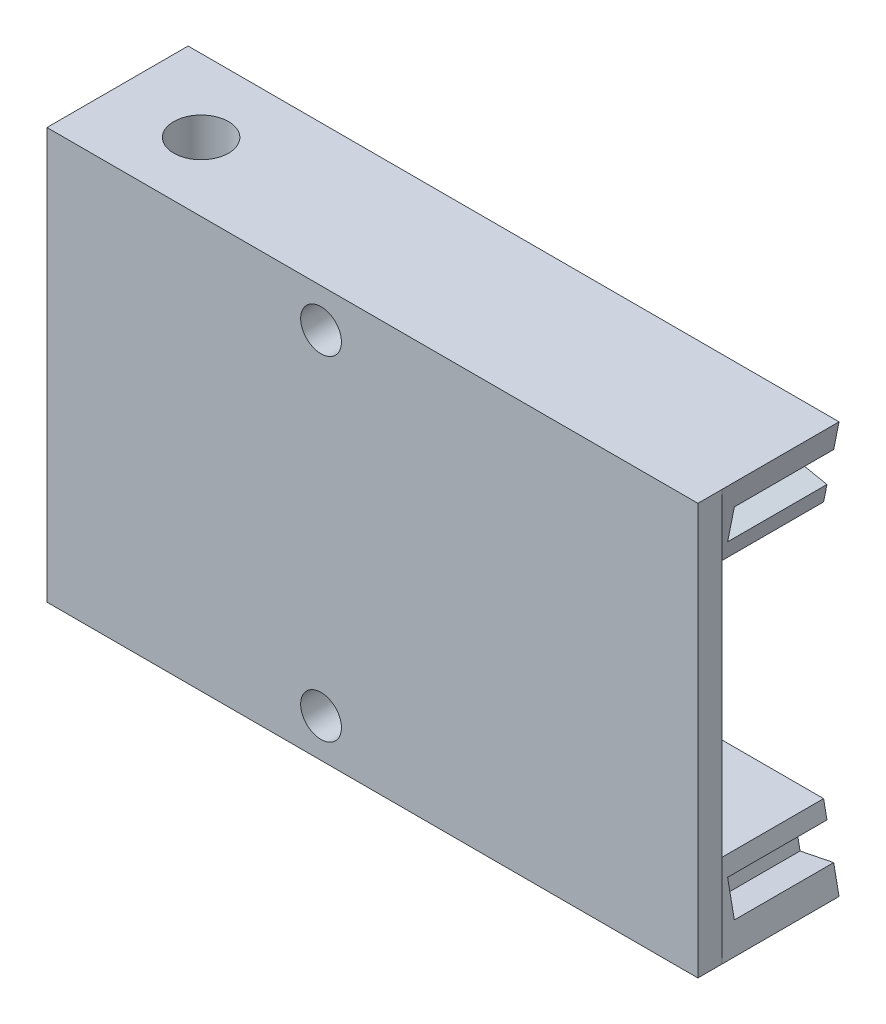
ISO-10303-21;
HEADER;
FILE_DESCRIPTION(('STEP AP214'),'2;1');
FILE_NAME('part.step','',(''),(''),'','','');
FILE_SCHEMA(('AUTOMOTIVE_DESIGN { 1 0 10303 214 1 1 1 1 }'));
ENDSEC;
DATA;
#1=APPLICATION_CONTEXT('core data for automotive mechanical design processes');
#2=APPLICATION_PROTOCOL_DEFINITION('international standard','automotive_design',2000,#1);
#3=PRODUCT_CONTEXT('',#1,'mechanical');
#4=PRODUCT('Part','Part','',(#3));
#5=PRODUCT_RELATED_PRODUCT_CATEGORY('part','',(#4));
#6=PRODUCT_DEFINITION_FORMATION('','',#4);
#7=PRODUCT_DEFINITION_CONTEXT('part definition',#1,'design');
#8=PRODUCT_DEFINITION('design','',#6,#7);
#9=PRODUCT_DEFINITION_SHAPE('','',#8);
#10=(LENGTH_UNIT() NAMED_UNIT(*) SI_UNIT(.MILLI.,.METRE.));
#11=(NAMED_UNIT(*) PLANE_ANGLE_UNIT() SI_UNIT($,.RADIAN.));
#12=(NAMED_UNIT(*) SI_UNIT($,.STERADIAN.) SOLID_ANGLE_UNIT());
#13=UNCERTAINTY_MEASURE_WITH_UNIT(LENGTH_MEASURE(1.E-05),#10,'distance_accuracy_value','');
#14=(GEOMETRIC_REPRESENTATION_CONTEXT(3) GLOBAL_UNCERTAINTY_ASSIGNED_CONTEXT((#13)) GLOBAL_UNIT_ASSIGNED_CONTEXT((#10,
#11,#12)) REPRESENTATION_CONTEXT('',''));
#15=CARTESIAN_POINT('',(0.,0.,0.));
#16=DIRECTION('',(0.,0.,1.));
#17=DIRECTION('',(1.,0.,0.));
#18=AXIS2_PLACEMENT_3D('',#15,#16,#17);
#19=CARTESIAN_POINT('',(0.,12.,-4.12));
#20=DIRECTION('',(0.,0.,1.));
#21=DIRECTION('',(1.,0.,0.));
#22=AXIS2_PLACEMENT_3D('',#19,#20,#21);
#23=PLANE('',#22);
#24=CARTESIAN_POINT('',(4.,1.125,-4.12));
#25=DIRECTION('',(0.,0.,-1.));
#26=DIRECTION('',(-1.,0.,0.));
#27=AXIS2_PLACEMENT_3D('',#24,#25,#26);
#28=CIRCLE('',#27,0.59563);
#29=CARTESIAN_POINT('',(3.40437,1.125,-4.12));
#30=VERTEX_POINT('',#29);
#31=EDGE_CURVE('E413',#30,#30,#28,.T.);
#32=ORIENTED_EDGE('',*,*,#31,.F.);
#33=EDGE_LOOP('',(#32));
#34=FACE_BOUND('',#33,.T.);
#35=DIRECTION('',(0.980580675704681,0.196116135069379,0.));
#36=VECTOR('',#35,1.);
#37=CARTESIAN_POINT('',(13.8635935270636,0.583012851373601,-4.12));
#38=LINE('',#37,#36);
#39=CARTESIAN_POINT('',(13.8635935270636,0.583012851373601,-4.12));
#40=VERTEX_POINT('',#39);
#41=CARTESIAN_POINT('',(14.8441742027683,0.77912898644298,-4.12));
#42=VERTEX_POINT('',#41);
#43=EDGE_CURVE('E188',#40,#42,#38,.T.);
#44=ORIENTED_EDGE('',*,*,#43,.T.);
#45=DIRECTION('',(0.196116135069379,-0.980580675704681,0.));
#46=VECTOR('',#45,1.);
#47=CARTESIAN_POINT('',(15.,0.,-4.12));
#48=LINE('',#47,#46);
#49=CARTESIAN_POINT('',(15.,0.,-4.12));
#50=VERTEX_POINT('',#49);
#51=EDGE_CURVE('E239',#42,#50,#48,.T.);
#52=ORIENTED_EDGE('',*,*,#51,.T.);
#53=DIRECTION('',(-1.,0.,0.));
#54=VECTOR('',#53,1.);
#55=CARTESIAN_POINT('',(0.,0.,-4.12));
#56=LINE('',#55,#54);
#57=CARTESIAN_POINT('',(-4.,0.,-4.12));
#58=VERTEX_POINT('',#57);
#59=EDGE_CURVE('E275',#50,#58,#56,.T.);
#60=ORIENTED_EDGE('',*,*,#59,.T.);
#61=DIRECTION('',(0.,-1.,0.));
#62=VECTOR('',#61,1.);
#63=CARTESIAN_POINT('',(-4.,2.25,-4.12));
#64=LINE('',#63,#62);
#65=CARTESIAN_POINT('',(-4.,2.25,-4.12));
#66=VERTEX_POINT('',#65);
#67=EDGE_CURVE('E210',#66,#58,#64,.T.);
#68=ORIENTED_EDGE('',*,*,#67,.F.);
#69=DIRECTION('',(1.,0.,0.));
#70=VECTOR('',#69,1.);
#71=CARTESIAN_POINT('',(0.,2.25,-4.12));
#72=LINE('',#71,#70);
#73=CARTESIAN_POINT('',(14.5500000001642,2.25,-4.12));
#74=VERTEX_POINT('',#73);
#75=EDGE_CURVE('E288',#66,#74,#72,.T.);
#76=ORIENTED_EDGE('',*,*,#75,.T.);
#77=CARTESIAN_POINT('',(14.6480580676989,1.75970966214765,-4.12));
#78=VERTEX_POINT('',#77);
#79=EDGE_CURVE('E177',#74,#78,#48,.T.);
#80=ORIENTED_EDGE('',*,*,#79,.T.);
#81=DIRECTION('',(0.980580675704681,0.196116135069379,0.));
#82=VECTOR('',#81,1.);
#83=CARTESIAN_POINT('',(13.6674773919942,1.56359352707828,-4.12));
#84=LINE('',#83,#82);
#85=CARTESIAN_POINT('',(13.6674773919942,1.56359352707828,-4.12));
#86=VERTEX_POINT('',#85);
#87=EDGE_CURVE('E54',#86,#78,#84,.T.);
#88=ORIENTED_EDGE('',*,*,#87,.F.);
#89=DIRECTION('',(0.196116135069379,-0.980580675704681,0.));
#90=VECTOR('',#89,1.);
#91=CARTESIAN_POINT('',(13.6674773919942,1.56359352707828,-4.12));
#92=LINE('',#91,#90);
#93=EDGE_CURVE('E165',#86,#40,#92,.T.);
#94=ORIENTED_EDGE('',*,*,#93,.T.);
#95=EDGE_LOOP('',(#44,#52,#60,#68,#76,#80,#88,#94));
#96=FACE_BOUND('',#95,.T.);
#97=ADVANCED_FACE('F37',(#34,#96),#23,.F.);
#98=CARTESIAN_POINT('',(15.,0.,-0.7));
#99=DIRECTION('',(0.980580675704681,0.196116135069379,0.));
#100=DIRECTION('',(-0.196116135069379,0.980580675704681,0.));
#101=AXIS2_PLACEMENT_3D('',#98,#99,#100);
#102=PLANE('',#101);
#103=ORIENTED_EDGE('',*,*,#51,.F.);
#104=DIRECTION('',(0.,0.,1.));
#105=VECTOR('',#104,1.);
#106=CARTESIAN_POINT('',(14.8441742027683,0.77912898644298,-4.12));
#107=LINE('',#106,#105);
#108=CARTESIAN_POINT('',(14.8441742027683,0.77912898644298,-1.22));
#109=VERTEX_POINT('',#108);
#110=EDGE_CURVE('E173',#42,#109,#107,.T.);
#111=ORIENTED_EDGE('',*,*,#110,.T.);
#112=DIRECTION('',(-0.196116135069379,0.980580675704681,0.));
#113=VECTOR('',#112,1.);
#114=CARTESIAN_POINT('',(14.6480580676989,1.75970966214765,-1.22));
#115=LINE('',#114,#113);
#116=CARTESIAN_POINT('',(14.6480580676989,1.75970966214765,-1.22));
#117=VERTEX_POINT('',#116);
#118=EDGE_CURVE('E421',#109,#117,#115,.T.);
#119=ORIENTED_EDGE('',*,*,#118,.T.);
#120=DIRECTION('',(0.,0.,-1.));
#121=VECTOR('',#120,1.);
#122=CARTESIAN_POINT('',(14.6480580676989,1.75970966214765,-4.12));
#123=LINE('',#122,#121);
#124=EDGE_CURVE('E419',#117,#78,#123,.T.);
#125=ORIENTED_EDGE('',*,*,#124,.T.);
#126=ORIENTED_EDGE('',*,*,#79,.F.);
#127=DIRECTION('',(0.,0.,-1.));
#128=VECTOR('',#127,1.);
#129=CARTESIAN_POINT('',(14.5500000001642,2.25,-0.7));
#130=LINE('',#129,#128);
#131=CARTESIAN_POINT('',(14.5500000001642,2.25,-0.7));
#132=VERTEX_POINT('',#131);
#133=EDGE_CURVE('E250',#132,#74,#130,.T.);
#134=ORIENTED_EDGE('',*,*,#133,.F.);
#135=DIRECTION('',(0.196116135069379,-0.980580675704681,0.));
#136=VECTOR('',#135,1.);
#137=CARTESIAN_POINT('',(15.,0.,-0.7));
#138=LINE('',#137,#136);
#139=CARTESIAN_POINT('',(15.,0.,-0.7));
#140=VERTEX_POINT('',#139);
#141=EDGE_CURVE('E245',#132,#140,#138,.T.);
#142=ORIENTED_EDGE('',*,*,#141,.T.);
#143=DIRECTION('',(0.,0.,-1.));
#144=VECTOR('',#143,1.);
#145=CARTESIAN_POINT('',(15.,0.,-0.7));
#146=LINE('',#145,#144);
#147=EDGE_CURVE('E248',#140,#50,#146,.T.);
#148=ORIENTED_EDGE('',*,*,#147,.T.);
#149=EDGE_LOOP('',(#103,#111,#119,#125,#126,#134,#142,#148));
#150=FACE_BOUND('',#149,.T.);
#151=ADVANCED_FACE('F316',(#150),#102,.T.);
#152=CARTESIAN_POINT('',(15.,12.,0.));
#153=DIRECTION('',(-1.,0.,0.));
#154=DIRECTION('',(0.,0.,1.));
#155=AXIS2_PLACEMENT_3D('',#152,#153,#154);
#156=PLANE('',#155);
#157=DIRECTION('',(0.,0.,-1.));
#158=VECTOR('',#157,1.);
#159=CARTESIAN_POINT('',(15.,0.,0.));
#160=LINE('',#159,#158);
#161=CARTESIAN_POINT('',(15.,0.,0.));
#162=VERTEX_POINT('',#161);
#163=EDGE_CURVE('E282',#162,#140,#160,.T.);
#164=ORIENTED_EDGE('',*,*,#163,.T.);
#165=DIRECTION('',(0.,1.,0.));
#166=VECTOR('',#165,1.);
#167=CARTESIAN_POINT('',(15.,12.,-0.7));
#168=LINE('',#167,#166);
#169=CARTESIAN_POINT('',(15.,12.,-0.7));
#170=VERTEX_POINT('',#169);
#171=EDGE_CURVE('E11',#140,#170,#168,.T.);
#172=ORIENTED_EDGE('',*,*,#171,.T.);
#173=DIRECTION('',(0.,0.,-1.));
#174=VECTOR('',#173,1.);
#175=CARTESIAN_POINT('',(15.,12.,0.));
#176=LINE('',#175,#174);
#177=CARTESIAN_POINT('',(15.,12.,0.));
#178=VERTEX_POINT('',#177);
#179=EDGE_CURVE('E274',#178,#170,#176,.T.);
#180=ORIENTED_EDGE('',*,*,#179,.F.);
#181=DIRECTION('',(0.,-1.,0.));
#182=VECTOR('',#181,1.);
#183=CARTESIAN_POINT('',(15.,12.,0.));
#184=LINE('',#183,#182);
#185=EDGE_CURVE('E280',#178,#162,#184,.T.);
#186=ORIENTED_EDGE('',*,*,#185,.T.);
#187=EDGE_LOOP('',(#164,#172,#180,#186));
#188=FACE_BOUND('',#187,.T.);
#189=ADVANCED_FACE('F323',(#188),#156,.F.);
#190=CARTESIAN_POINT('',(25.,2.25,-4.12));
#191=DIRECTION('',(0.,-1.,0.));
#192=DIRECTION('',(0.,0.,-1.));
#193=AXIS2_PLACEMENT_3D('',#190,#191,#192);
#194=PLANE('',#193);
#195=CARTESIAN_POINT('',(-1.5,2.25,-2.));
#196=DIRECTION('',(0.,-1.,0.));
#197=DIRECTION('',(0.,0.,-1.));
#198=AXIS2_PLACEMENT_3D('',#195,#196,#197);
#199=CIRCLE('',#198,0.799999999999989);
#200=CARTESIAN_POINT('',(-1.5,2.25,-2.79999999999999));
#201=VERTEX_POINT('',#200);
#202=EDGE_CURVE('E410',#201,#201,#199,.T.);
#203=ORIENTED_EDGE('',*,*,#202,.T.);
#204=EDGE_LOOP('',(#203));
#205=FACE_BOUND('',#204,.T.);
#206=ORIENTED_EDGE('',*,*,#133,.T.);
#207=ORIENTED_EDGE('',*,*,#75,.F.);
#208=DIRECTION('',(0.,0.,-1.));
#209=VECTOR('',#208,1.);
#210=CARTESIAN_POINT('',(-4.,2.25,-0.7));
#211=LINE('',#210,#209);
#212=CARTESIAN_POINT('',(-4.,2.25,-0.7));
#213=VERTEX_POINT('',#212);
#214=EDGE_CURVE('E207',#213,#66,#211,.T.);
#215=ORIENTED_EDGE('',*,*,#214,.F.);
#216=DIRECTION('',(-1.,0.,0.));
#217=VECTOR('',#216,1.);
#218=CARTESIAN_POINT('',(25.,2.25,-0.7));
#219=LINE('',#218,#217);
#220=EDGE_CURVE('E266',#132,#213,#219,.T.);
#221=ORIENTED_EDGE('',*,*,#220,.F.);
#222=EDGE_LOOP('',(#206,#207,#215,#221));
#223=FACE_BOUND('',#222,.T.);
#224=ADVANCED_FACE('F329',(#205,#223),#194,.F.);
#225=CARTESIAN_POINT('',(4.,10.875,-4.12));
#226=DIRECTION('',(0.,0.,-1.));
#227=DIRECTION('',(-1.,0.,0.));
#228=AXIS2_PLACEMENT_3D('',#225,#226,#227);
#229=CIRCLE('',#228,0.59563);
#230=CARTESIAN_POINT('',(3.40437,10.875,-4.12));
#231=VERTEX_POINT('',#230);
#232=EDGE_CURVE('E213',#231,#231,#229,.T.);
#233=ORIENTED_EDGE('',*,*,#232,.F.);
#234=EDGE_LOOP('',(#233));
#235=FACE_BOUND('',#234,.T.);
#236=DIRECTION('',(0.196116135069379,0.980580675704681,0.));
#237=VECTOR('',#236,1.);
#238=CARTESIAN_POINT('',(13.6674773919942,10.4364064729217,-4.12));
#239=LINE('',#238,#237);
#240=CARTESIAN_POINT('',(13.6674773919942,10.4364064729217,-4.12));
#241=VERTEX_POINT('',#240);
#242=CARTESIAN_POINT('',(13.8635935270636,11.4169871486264,-4.12));
#243=VERTEX_POINT('',#242);
#244=EDGE_CURVE('E217',#241,#243,#239,.T.);
#245=ORIENTED_EDGE('',*,*,#244,.F.);
#246=DIRECTION('',(0.980580675704681,-0.196116135069379,0.));
#247=VECTOR('',#246,1.);
#248=CARTESIAN_POINT('',(13.6674773919942,10.4364064729217,-4.12));
#249=LINE('',#248,#247);
#250=CARTESIAN_POINT('',(14.6480580676989,10.2402903378523,-4.12));
#251=VERTEX_POINT('',#250);
#252=EDGE_CURVE('E236',#241,#251,#249,.T.);
#253=ORIENTED_EDGE('',*,*,#252,.T.);
#254=DIRECTION('',(0.196116135069379,0.980580675704681,0.));
#255=VECTOR('',#254,1.);
#256=CARTESIAN_POINT('',(15.,12.,-4.12));
#257=LINE('',#256,#255);
#258=CARTESIAN_POINT('',(14.5500000001642,9.75,-4.12));
#259=VERTEX_POINT('',#258);
#260=EDGE_CURVE('E260',#259,#251,#257,.T.);
#261=ORIENTED_EDGE('',*,*,#260,.F.);
#262=DIRECTION('',(-1.,0.,0.));
#263=VECTOR('',#262,1.);
#264=CARTESIAN_POINT('',(0.,9.75,-4.12));
#265=LINE('',#264,#263);
#266=CARTESIAN_POINT('',(-4.,9.75,-4.12));
#267=VERTEX_POINT('',#266);
#268=EDGE_CURVE('E46',#259,#267,#265,.T.);
#269=ORIENTED_EDGE('',*,*,#268,.T.);
#270=DIRECTION('',(0.,-1.,0.));
#271=VECTOR('',#270,1.);
#272=CARTESIAN_POINT('',(-4.,12.,-4.12));
#273=LINE('',#272,#271);
#274=CARTESIAN_POINT('',(-4.,12.,-4.12));
#275=VERTEX_POINT('',#274);
#276=EDGE_CURVE('E198',#275,#267,#273,.T.);
#277=ORIENTED_EDGE('',*,*,#276,.F.);
#278=DIRECTION('',(-1.,0.,0.));
#279=VECTOR('',#278,1.);
#280=CARTESIAN_POINT('',(0.,12.,-4.12));
#281=LINE('',#280,#279);
#282=CARTESIAN_POINT('',(15.,12.,-4.12));
#283=VERTEX_POINT('',#282);
#284=EDGE_CURVE('E278',#283,#275,#281,.T.);
#285=ORIENTED_EDGE('',*,*,#284,.F.);
#286=CARTESIAN_POINT('',(14.8441742027683,11.220871013557,-4.12));
#287=VERTEX_POINT('',#286);
#288=EDGE_CURVE('E253',#287,#283,#257,.T.);
#289=ORIENTED_EDGE('',*,*,#288,.F.);
#290=DIRECTION('',(0.980580675704681,-0.196116135069379,0.));
#291=VECTOR('',#290,1.);
#292=CARTESIAN_POINT('',(13.8635935270636,11.4169871486264,-4.12));
#293=LINE('',#292,#291);
#294=EDGE_CURVE('E62',#243,#287,#293,.T.);
#295=ORIENTED_EDGE('',*,*,#294,.F.);
#296=EDGE_LOOP('',(#245,#253,#261,#269,#277,#285,#289,#295));
#297=FACE_BOUND('',#296,.T.);
#298=ADVANCED_FACE('F319',(#235,#297),#23,.F.);
#299=CARTESIAN_POINT('',(0.,12.,0.));
#300=DIRECTION('',(0.,0.,-1.));
#301=DIRECTION('',(-1.,0.,0.));
#302=AXIS2_PLACEMENT_3D('',#299,#300,#301);
#303=PLANE('',#302);
#304=CARTESIAN_POINT('',(4.,1.125,0.));
#305=DIRECTION('',(0.,0.,-1.));
#306=DIRECTION('',(-1.,0.,0.));
#307=AXIS2_PLACEMENT_3D('',#304,#305,#306);
#308=CIRCLE('',#307,0.595629999999999);
#309=CARTESIAN_POINT('',(3.40437,1.125,0.));
#310=VERTEX_POINT('',#309);
#311=EDGE_CURVE('E41',#310,#310,#308,.T.);
#312=ORIENTED_EDGE('',*,*,#311,.T.);
#313=EDGE_LOOP('',(#312));
#314=FACE_BOUND('',#313,.T.);
#315=CARTESIAN_POINT('',(4.,10.875,0.));
#316=DIRECTION('',(0.,0.,-1.));
#317=DIRECTION('',(-1.,0.,0.));
#318=AXIS2_PLACEMENT_3D('',#315,#316,#317);
#319=CIRCLE('',#318,0.595629999999999);
#320=CARTESIAN_POINT('',(3.40437,10.875,0.));
#321=VERTEX_POINT('',#320);
#322=EDGE_CURVE('E216',#321,#321,#319,.T.);
#323=ORIENTED_EDGE('',*,*,#322,.T.);
#324=EDGE_LOOP('',(#323));
#325=FACE_BOUND('',#324,.T.);
#326=DIRECTION('',(1.,0.,0.));
#327=VECTOR('',#326,1.);
#328=CARTESIAN_POINT('',(0.,0.,0.));
#329=LINE('',#328,#327);
#330=CARTESIAN_POINT('',(-4.,0.,0.));
#331=VERTEX_POINT('',#330);
#332=EDGE_CURVE('E270',#331,#162,#329,.T.);
#333=ORIENTED_EDGE('',*,*,#332,.T.);
#334=ORIENTED_EDGE('',*,*,#185,.F.);
#335=DIRECTION('',(1.,0.,0.));
#336=VECTOR('',#335,1.);
#337=CARTESIAN_POINT('',(0.,12.,0.));
#338=LINE('',#337,#336);
#339=CARTESIAN_POINT('',(-4.,12.,0.));
#340=VERTEX_POINT('',#339);
#341=EDGE_CURVE('E272',#340,#178,#338,.T.);
#342=ORIENTED_EDGE('',*,*,#341,.F.);
#343=DIRECTION('',(0.,1.,0.));
#344=VECTOR('',#343,1.);
#345=CARTESIAN_POINT('',(-4.,0.,0.));
#346=LINE('',#345,#344);
#347=EDGE_CURVE('E192',#331,#340,#346,.T.);
#348=ORIENTED_EDGE('',*,*,#347,.F.);
#349=EDGE_LOOP('',(#333,#334,#342,#348));
#350=FACE_BOUND('',#349,.T.);
#351=ADVANCED_FACE('F39',(#314,#325,#350),#303,.F.);
#352=CARTESIAN_POINT('',(0.,12.,0.));
#353=DIRECTION('',(0.,-1.,0.));
#354=DIRECTION('',(0.,0.,-1.));
#355=AXIS2_PLACEMENT_3D('',#352,#353,#354);
#356=PLANE('',#355);
#357=CARTESIAN_POINT('',(-1.5,12.,-2.));
#358=DIRECTION('',(0.,1.,0.));
#359=DIRECTION('',(0.,0.,1.));
#360=AXIS2_PLACEMENT_3D('',#357,#358,#359);
#361=CIRCLE('',#360,0.79999999999999);
#362=CARTESIAN_POINT('',(-1.5,12.,-1.20000000000001));
#363=VERTEX_POINT('',#362);
#364=EDGE_CURVE('E184',#363,#363,#361,.T.);
#365=ORIENTED_EDGE('',*,*,#364,.F.);
#366=EDGE_LOOP('',(#365));
#367=FACE_BOUND('',#366,.T.);
#368=ORIENTED_EDGE('',*,*,#284,.T.);
#369=DIRECTION('',(0.,0.,-1.));
#370=VECTOR('',#369,1.);
#371=CARTESIAN_POINT('',(-4.,12.,0.));
#372=LINE('',#371,#370);
#373=EDGE_CURVE('E195',#340,#275,#372,.T.);
#374=ORIENTED_EDGE('',*,*,#373,.F.);
#375=ORIENTED_EDGE('',*,*,#341,.T.);
#376=ORIENTED_EDGE('',*,*,#179,.T.);
#377=DIRECTION('',(0.,0.,-1.));
#378=VECTOR('',#377,1.);
#379=CARTESIAN_POINT('',(15.,12.,-0.7));
#380=LINE('',#379,#378);
#381=EDGE_CURVE('E263',#170,#283,#380,.T.);
#382=ORIENTED_EDGE('',*,*,#381,.T.);
#383=EDGE_LOOP('',(#368,#374,#375,#376,#382));
#384=FACE_BOUND('',#383,.T.);
#385=ADVANCED_FACE('F335',(#367,#384),#356,.F.);
#386=CARTESIAN_POINT('',(0.,0.,0.));
#387=DIRECTION('',(0.,-1.,0.));
#388=DIRECTION('',(0.,0.,-1.));
#389=AXIS2_PLACEMENT_3D('',#386,#387,#388);
#390=PLANE('',#389);
#391=CARTESIAN_POINT('',(-1.5,0.,-2.));
#392=DIRECTION('',(0.,-1.,0.));
#393=DIRECTION('',(0.,0.,-1.));
#394=AXIS2_PLACEMENT_3D('',#391,#392,#393);
#395=CIRCLE('',#394,0.79999999999999);
#396=CARTESIAN_POINT('',(-1.5,0.,-2.79999999999999));
#397=VERTEX_POINT('',#396);
#398=EDGE_CURVE('E408',#397,#397,#395,.T.);
#399=ORIENTED_EDGE('',*,*,#398,.F.);
#400=EDGE_LOOP('',(#399));
#401=FACE_BOUND('',#400,.T.);
#402=ORIENTED_EDGE('',*,*,#332,.F.);
#403=DIRECTION('',(0.,0.,1.));
#404=VECTOR('',#403,1.);
#405=CARTESIAN_POINT('',(-4.,0.,-4.12));
#406=LINE('',#405,#404);
#407=EDGE_CURVE('E189',#58,#331,#406,.T.);
#408=ORIENTED_EDGE('',*,*,#407,.F.);
#409=ORIENTED_EDGE('',*,*,#59,.F.);
#410=ORIENTED_EDGE('',*,*,#147,.F.);
#411=ORIENTED_EDGE('',*,*,#163,.F.);
#412=EDGE_LOOP('',(#402,#408,#409,#410,#411));
#413=FACE_BOUND('',#412,.T.);
#414=ADVANCED_FACE('F372',(#401,#413),#390,.T.);
#415=CARTESIAN_POINT('',(25.,2.25,-0.7));
#416=DIRECTION('',(0.,0.,1.));
#417=DIRECTION('',(0.,-1.,0.));
#418=AXIS2_PLACEMENT_3D('',#415,#416,#417);
#419=PLANE('',#418);
#420=ORIENTED_EDGE('',*,*,#171,.F.);
#421=ORIENTED_EDGE('',*,*,#141,.F.);
#422=ORIENTED_EDGE('',*,*,#220,.T.);
#423=DIRECTION('',(0.,-1.,0.));
#424=VECTOR('',#423,1.);
#425=CARTESIAN_POINT('',(-4.,9.75,-0.7));
#426=LINE('',#425,#424);
#427=CARTESIAN_POINT('',(-4.,9.75,-0.7));
#428=VERTEX_POINT('',#427);
#429=EDGE_CURVE('E204',#428,#213,#426,.T.);
#430=ORIENTED_EDGE('',*,*,#429,.F.);
#431=DIRECTION('',(-1.,0.,0.));
#432=VECTOR('',#431,1.);
#433=CARTESIAN_POINT('',(25.,9.75,-0.7));
#434=LINE('',#433,#432);
#435=CARTESIAN_POINT('',(14.5500000001642,9.75,-0.7));
#436=VERTEX_POINT('',#435);
#437=EDGE_CURVE('E268',#436,#428,#434,.T.);
#438=ORIENTED_EDGE('',*,*,#437,.F.);
#439=DIRECTION('',(0.196116135069379,0.980580675704681,0.));
#440=VECTOR('',#439,1.);
#441=CARTESIAN_POINT('',(15.,12.,-0.7));
#442=LINE('',#441,#440);
#443=EDGE_CURVE('E256',#436,#170,#442,.T.);
#444=ORIENTED_EDGE('',*,*,#443,.T.);
#445=EDGE_LOOP('',(#420,#421,#422,#430,#438,#444));
#446=FACE_BOUND('',#445,.T.);
#447=ADVANCED_FACE('F362',(#446),#419,.F.);
#448=CARTESIAN_POINT('',(25.,9.75,-4.12));
#449=DIRECTION('',(0.,1.,0.));
#450=DIRECTION('',(0.,0.,1.));
#451=AXIS2_PLACEMENT_3D('',#448,#449,#450);
#452=PLANE('',#451);
#453=CARTESIAN_POINT('',(-1.5,9.75,-2.));
#454=DIRECTION('',(0.,1.,0.));
#455=DIRECTION('',(0.,0.,1.));
#456=AXIS2_PLACEMENT_3D('',#453,#454,#455);
#457=CIRCLE('',#456,0.799999999999989);
#458=CARTESIAN_POINT('',(-1.5,9.75,-1.20000000000001));
#459=VERTEX_POINT('',#458);
#460=EDGE_CURVE('E187',#459,#459,#457,.T.);
#461=ORIENTED_EDGE('',*,*,#460,.T.);
#462=EDGE_LOOP('',(#461));
#463=FACE_BOUND('',#462,.T.);
#464=ORIENTED_EDGE('',*,*,#268,.F.);
#465=DIRECTION('',(0.,0.,-1.));
#466=VECTOR('',#465,1.);
#467=CARTESIAN_POINT('',(14.5500000001642,9.75,-0.7));
#468=LINE('',#467,#466);
#469=EDGE_CURVE('E259',#436,#259,#468,.T.);
#470=ORIENTED_EDGE('',*,*,#469,.F.);
#471=ORIENTED_EDGE('',*,*,#437,.T.);
#472=DIRECTION('',(0.,0.,1.));
#473=VECTOR('',#472,1.);
#474=CARTESIAN_POINT('',(-4.,9.75,-4.12));
#475=LINE('',#474,#473);
#476=EDGE_CURVE('E201',#267,#428,#475,.T.);
#477=ORIENTED_EDGE('',*,*,#476,.F.);
#478=EDGE_LOOP('',(#464,#470,#471,#477));
#479=FACE_BOUND('',#478,.T.);
#480=ADVANCED_FACE('F295',(#463,#479),#452,.F.);
#481=CARTESIAN_POINT('',(15.,12.,-0.7));
#482=DIRECTION('',(-0.980580675704681,0.196116135069379,0.));
#483=DIRECTION('',(-0.196116135069379,-0.980580675704681,0.));
#484=AXIS2_PLACEMENT_3D('',#481,#482,#483);
#485=PLANE('',#484);
#486=ORIENTED_EDGE('',*,*,#260,.T.);
#487=DIRECTION('',(0.,0.,-1.));
#488=VECTOR('',#487,1.);
#489=CARTESIAN_POINT('',(14.6480580676989,10.2402903378523,-4.12));
#490=LINE('',#489,#488);
#491=CARTESIAN_POINT('',(14.6480580676989,10.2402903378523,-1.22));
#492=VERTEX_POINT('',#491);
#493=EDGE_CURVE('E221',#492,#251,#490,.T.);
#494=ORIENTED_EDGE('',*,*,#493,.F.);
#495=DIRECTION('',(-0.196116135069379,-0.980580675704681,0.));
#496=VECTOR('',#495,1.);
#497=CARTESIAN_POINT('',(14.6480580676989,10.2402903378523,-1.22));
#498=LINE('',#497,#496);
#499=CARTESIAN_POINT('',(14.8441742027683,11.220871013557,-1.22));
#500=VERTEX_POINT('',#499);
#501=EDGE_CURVE('E232',#500,#492,#498,.T.);
#502=ORIENTED_EDGE('',*,*,#501,.F.);
#503=DIRECTION('',(0.,0.,1.));
#504=VECTOR('',#503,1.);
#505=CARTESIAN_POINT('',(14.8441742027683,11.220871013557,-4.12));
#506=LINE('',#505,#504);
#507=EDGE_CURVE('E230',#287,#500,#506,.T.);
#508=ORIENTED_EDGE('',*,*,#507,.F.);
#509=ORIENTED_EDGE('',*,*,#288,.T.);
#510=ORIENTED_EDGE('',*,*,#381,.F.);
#511=ORIENTED_EDGE('',*,*,#443,.F.);
#512=ORIENTED_EDGE('',*,*,#469,.T.);
#513=EDGE_LOOP('',(#486,#494,#502,#508,#509,#510,#511,#512));
#514=FACE_BOUND('',#513,.T.);
#515=ADVANCED_FACE('F353',(#514),#485,.F.);
#516=CARTESIAN_POINT('',(13.6674773919942,10.4364064729217,-4.12));
#517=DIRECTION('',(-0.196116135069379,-0.980580675704681,0.));
#518=DIRECTION('',(0.980580675704681,-0.196116135069379,0.));
#519=AXIS2_PLACEMENT_3D('',#516,#517,#518);
#520=PLANE('',#519);
#521=ORIENTED_EDGE('',*,*,#493,.T.);
#522=ORIENTED_EDGE('',*,*,#252,.F.);
#523=DIRECTION('',(0.,0.,-1.));
#524=VECTOR('',#523,1.);
#525=CARTESIAN_POINT('',(13.6674773919942,10.4364064729217,-4.12));
#526=LINE('',#525,#524);
#527=CARTESIAN_POINT('',(13.6674773919942,10.4364064729217,-1.22));
#528=VERTEX_POINT('',#527);
#529=EDGE_CURVE('E227',#528,#241,#526,.T.);
#530=ORIENTED_EDGE('',*,*,#529,.F.);
#531=DIRECTION('',(0.980580675704681,-0.196116135069379,0.));
#532=VECTOR('',#531,1.);
#533=CARTESIAN_POINT('',(13.6674773919942,10.4364064729217,-1.22));
#534=LINE('',#533,#532);
#535=EDGE_CURVE('E240',#528,#492,#534,.T.);
#536=ORIENTED_EDGE('',*,*,#535,.T.);
#537=EDGE_LOOP('',(#521,#522,#530,#536));
#538=FACE_BOUND('',#537,.T.);
#539=ADVANCED_FACE('F349',(#538),#520,.F.);
#540=CARTESIAN_POINT('',(13.6674773919942,10.4364064729217,-1.22));
#541=DIRECTION('',(0.,0.,1.));
#542=DIRECTION('',(0.,-1.,0.));
#543=AXIS2_PLACEMENT_3D('',#540,#541,#542);
#544=PLANE('',#543);
#545=ORIENTED_EDGE('',*,*,#501,.T.);
#546=ORIENTED_EDGE('',*,*,#535,.F.);
#547=DIRECTION('',(-0.196116135069379,-0.980580675704681,0.));
#548=VECTOR('',#547,1.);
#549=CARTESIAN_POINT('',(13.6674773919942,10.4364064729217,-1.22));
#550=LINE('',#549,#548);
#551=CARTESIAN_POINT('',(13.8635935270636,11.4169871486264,-1.22));
#552=VERTEX_POINT('',#551);
#553=EDGE_CURVE('E224',#552,#528,#550,.T.);
#554=ORIENTED_EDGE('',*,*,#553,.F.);
#555=DIRECTION('',(0.980580675704681,-0.196116135069379,0.));
#556=VECTOR('',#555,1.);
#557=CARTESIAN_POINT('',(13.8635935270636,11.4169871486264,-1.22));
#558=LINE('',#557,#556);
#559=EDGE_CURVE('E242',#552,#500,#558,.T.);
#560=ORIENTED_EDGE('',*,*,#559,.T.);
#561=EDGE_LOOP('',(#545,#546,#554,#560));
#562=FACE_BOUND('',#561,.T.);
#563=ADVANCED_FACE('F383',(#562),#544,.F.);
#564=CARTESIAN_POINT('',(13.8635935270636,11.4169871486264,-4.12));
#565=DIRECTION('',(0.196116135069379,0.980580675704681,0.));
#566=DIRECTION('',(-0.980580675704681,0.196116135069379,0.));
#567=AXIS2_PLACEMENT_3D('',#564,#565,#566);
#568=PLANE('',#567);
#569=ORIENTED_EDGE('',*,*,#507,.T.);
#570=ORIENTED_EDGE('',*,*,#559,.F.);
#571=DIRECTION('',(0.,0.,1.));
#572=VECTOR('',#571,1.);
#573=CARTESIAN_POINT('',(13.8635935270636,11.4169871486264,-4.12));
#574=LINE('',#573,#572);
#575=EDGE_CURVE('E220',#243,#552,#574,.T.);
#576=ORIENTED_EDGE('',*,*,#575,.F.);
#577=ORIENTED_EDGE('',*,*,#294,.T.);
#578=EDGE_LOOP('',(#569,#570,#576,#577));
#579=FACE_BOUND('',#578,.T.);
#580=ADVANCED_FACE('F381',(#579),#568,.F.);
#581=CARTESIAN_POINT('',(11.134803940862,-2.22696078735984,0.));
#582=DIRECTION('',(0.980580675704681,-0.196116135069379,0.));
#583=DIRECTION('',(0.196116135069379,0.980580675704681,0.));
#584=AXIS2_PLACEMENT_3D('',#581,#582,#583);
#585=PLANE('',#584);
#586=ORIENTED_EDGE('',*,*,#244,.T.);
#587=ORIENTED_EDGE('',*,*,#575,.T.);
#588=ORIENTED_EDGE('',*,*,#553,.T.);
#589=ORIENTED_EDGE('',*,*,#529,.T.);
#590=EDGE_LOOP('',(#586,#587,#588,#589));
#591=FACE_BOUND('',#590,.T.);
#592=ADVANCED_FACE('F345',(#591),#585,.T.);
#593=CARTESIAN_POINT('',(4.,10.875,-4.12));
#594=DIRECTION('',(0.,0.,-1.));
#595=DIRECTION('',(-1.,0.,0.));
#596=AXIS2_PLACEMENT_3D('',#593,#594,#595);
#597=CYLINDRICAL_SURFACE('',#596,0.595629999999999);
#598=ORIENTED_EDGE('',*,*,#232,.T.);
#599=EDGE_LOOP('',(#598));
#600=FACE_BOUND('',#599,.T.);
#601=ORIENTED_EDGE('',*,*,#322,.F.);
#602=EDGE_LOOP('',(#601));
#603=FACE_BOUND('',#602,.T.);
#604=ADVANCED_FACE('F311',(#600,#603),#597,.F.);
#605=CARTESIAN_POINT('',(-4.,0.,0.));
#606=DIRECTION('',(-1.,0.,0.));
#607=DIRECTION('',(0.,0.,1.));
#608=AXIS2_PLACEMENT_3D('',#605,#606,#607);
#609=PLANE('',#608);
#610=ORIENTED_EDGE('',*,*,#407,.T.);
#611=ORIENTED_EDGE('',*,*,#347,.T.);
#612=ORIENTED_EDGE('',*,*,#373,.T.);
#613=ORIENTED_EDGE('',*,*,#276,.T.);
#614=ORIENTED_EDGE('',*,*,#476,.T.);
#615=ORIENTED_EDGE('',*,*,#429,.T.);
#616=ORIENTED_EDGE('',*,*,#214,.T.);
#617=ORIENTED_EDGE('',*,*,#67,.T.);
#618=EDGE_LOOP('',(#610,#611,#612,#613,#614,#615,#616,#617));
#619=FACE_BOUND('',#618,.T.);
#620=ADVANCED_FACE('F301',(#619),#609,.T.);
#621=CARTESIAN_POINT('',(-1.5,12.,-2.));
#622=DIRECTION('',(0.,1.,0.));
#623=DIRECTION('',(0.,0.,1.));
#624=AXIS2_PLACEMENT_3D('',#621,#622,#623);
#625=CYLINDRICAL_SURFACE('',#624,0.799999999999989);
#626=ORIENTED_EDGE('',*,*,#364,.T.);
#627=EDGE_LOOP('',(#626));
#628=FACE_BOUND('',#627,.T.);
#629=ORIENTED_EDGE('',*,*,#460,.F.);
#630=EDGE_LOOP('',(#629));
#631=FACE_BOUND('',#630,.T.);
#632=ADVANCED_FACE('F298',(#628,#631),#625,.F.);
#633=CARTESIAN_POINT('',(13.8635935270636,0.583012851373601,-4.12));
#634=DIRECTION('',(-0.196116135069379,0.980580675704681,0.));
#635=DIRECTION('',(-0.980580675704681,-0.196116135069379,0.));
#636=AXIS2_PLACEMENT_3D('',#633,#634,#635);
#637=PLANE('',#636);
#638=ORIENTED_EDGE('',*,*,#110,.F.);
#639=ORIENTED_EDGE('',*,*,#43,.F.);
#640=DIRECTION('',(0.,0.,1.));
#641=VECTOR('',#640,1.);
#642=CARTESIAN_POINT('',(13.8635935270636,0.583012851373601,-4.12));
#643=LINE('',#642,#641);
#644=CARTESIAN_POINT('',(13.8635935270636,0.583012851373601,-1.22));
#645=VERTEX_POINT('',#644);
#646=EDGE_CURVE('E169',#40,#645,#643,.T.);
#647=ORIENTED_EDGE('',*,*,#646,.T.);
#648=DIRECTION('',(0.980580675704681,0.196116135069379,0.));
#649=VECTOR('',#648,1.);
#650=CARTESIAN_POINT('',(13.8635935270636,0.583012851373601,-1.22));
#651=LINE('',#650,#649);
#652=EDGE_CURVE('E179',#645,#109,#651,.T.);
#653=ORIENTED_EDGE('',*,*,#652,.T.);
#654=EDGE_LOOP('',(#638,#639,#647,#653));
#655=FACE_BOUND('',#654,.T.);
#656=ADVANCED_FACE('F300',(#655),#637,.T.);
#657=CARTESIAN_POINT('',(13.6674773919942,1.56359352707828,-1.22));
#658=DIRECTION('',(0.,0.,-1.));
#659=DIRECTION('',(0.,1.,0.));
#660=AXIS2_PLACEMENT_3D('',#657,#658,#659);
#661=PLANE('',#660);
#662=ORIENTED_EDGE('',*,*,#118,.F.);
#663=ORIENTED_EDGE('',*,*,#652,.F.);
#664=DIRECTION('',(-0.196116135069379,0.980580675704681,0.));
#665=VECTOR('',#664,1.);
#666=CARTESIAN_POINT('',(13.6674773919942,1.56359352707828,-1.22));
#667=LINE('',#666,#665);
#668=CARTESIAN_POINT('',(13.6674773919942,1.56359352707828,-1.22));
#669=VERTEX_POINT('',#668);
#670=EDGE_CURVE('E164',#645,#669,#667,.T.);
#671=ORIENTED_EDGE('',*,*,#670,.T.);
#672=DIRECTION('',(0.980580675704681,0.196116135069379,0.));
#673=VECTOR('',#672,1.);
#674=CARTESIAN_POINT('',(13.6674773919942,1.56359352707828,-1.22));
#675=LINE('',#674,#673);
#676=EDGE_CURVE('E161',#669,#117,#675,.T.);
#677=ORIENTED_EDGE('',*,*,#676,.T.);
#678=EDGE_LOOP('',(#662,#663,#671,#677));
#679=FACE_BOUND('',#678,.T.);
#680=ADVANCED_FACE('F308',(#679),#661,.T.);
#681=CARTESIAN_POINT('',(13.6674773919942,1.56359352707828,-4.12));
#682=DIRECTION('',(0.196116135069379,-0.980580675704681,0.));
#683=DIRECTION('',(0.980580675704681,0.196116135069379,0.));
#684=AXIS2_PLACEMENT_3D('',#681,#682,#683);
#685=PLANE('',#684);
#686=ORIENTED_EDGE('',*,*,#124,.F.);
#687=ORIENTED_EDGE('',*,*,#676,.F.);
#688=DIRECTION('',(0.,0.,-1.));
#689=VECTOR('',#688,1.);
#690=CARTESIAN_POINT('',(13.6674773919942,1.56359352707828,-4.12));
#691=LINE('',#690,#689);
#692=EDGE_CURVE('E158',#669,#86,#691,.T.);
#693=ORIENTED_EDGE('',*,*,#692,.T.);
#694=ORIENTED_EDGE('',*,*,#87,.T.);
#695=EDGE_LOOP('',(#686,#687,#693,#694));
#696=FACE_BOUND('',#695,.T.);
#697=ADVANCED_FACE('F160',(#696),#685,.T.);
#698=CARTESIAN_POINT('',(11.134803940862,14.2269607873598,0.));
#699=DIRECTION('',(0.980580675704681,0.196116135069379,0.));
#700=DIRECTION('',(0.196116135069379,-0.980580675704681,0.));
#701=AXIS2_PLACEMENT_3D('',#698,#699,#700);
#702=PLANE('',#701);
#703=ORIENTED_EDGE('',*,*,#93,.F.);
#704=ORIENTED_EDGE('',*,*,#692,.F.);
#705=ORIENTED_EDGE('',*,*,#670,.F.);
#706=ORIENTED_EDGE('',*,*,#646,.F.);
#707=EDGE_LOOP('',(#703,#704,#705,#706));
#708=FACE_BOUND('',#707,.T.);
#709=ADVANCED_FACE('F168',(#708),#702,.T.);
#710=CARTESIAN_POINT('',(4.,1.125,-4.12));
#711=DIRECTION('',(0.,0.,-1.));
#712=DIRECTION('',(-1.,0.,0.));
#713=AXIS2_PLACEMENT_3D('',#710,#711,#712);
#714=CYLINDRICAL_SURFACE('',#713,0.595629999999999);
#715=ORIENTED_EDGE('',*,*,#31,.T.);
#716=EDGE_LOOP('',(#715));
#717=FACE_BOUND('',#716,.T.);
#718=ORIENTED_EDGE('',*,*,#311,.F.);
#719=EDGE_LOOP('',(#718));
#720=FACE_BOUND('',#719,.T.);
#721=ADVANCED_FACE('F437',(#717,#720),#714,.F.);
#722=CARTESIAN_POINT('',(-1.5,0.,-2.));
#723=DIRECTION('',(0.,-1.,0.));
#724=DIRECTION('',(0.,0.,-1.));
#725=AXIS2_PLACEMENT_3D('',#722,#723,#724);
#726=CYLINDRICAL_SURFACE('',#725,0.799999999999989);
#727=ORIENTED_EDGE('',*,*,#398,.T.);
#728=EDGE_LOOP('',(#727));
#729=FACE_BOUND('',#728,.T.);
#730=ORIENTED_EDGE('',*,*,#202,.F.);
#731=EDGE_LOOP('',(#730));
#732=FACE_BOUND('',#731,.T.);
#733=ADVANCED_FACE('F440',(#729,#732),#726,.F.);
#734=CLOSED_SHELL('',(#97,#151,#189,#224,#298,#351,#385,#414,#447,#480,#515,#539,#563,#580,#592,
#604,#620,#632,#656,#680,#697,#709,#721,#733));
#735=MANIFOLD_SOLID_BREP('B2',#734);
#736=ADVANCED_BREP_SHAPE_REPRESENTATION('',(#18,#735),#14);
#737=SHAPE_DEFINITION_REPRESENTATION(#9,#736);
ENDSEC;
END-ISO-10303-21;
